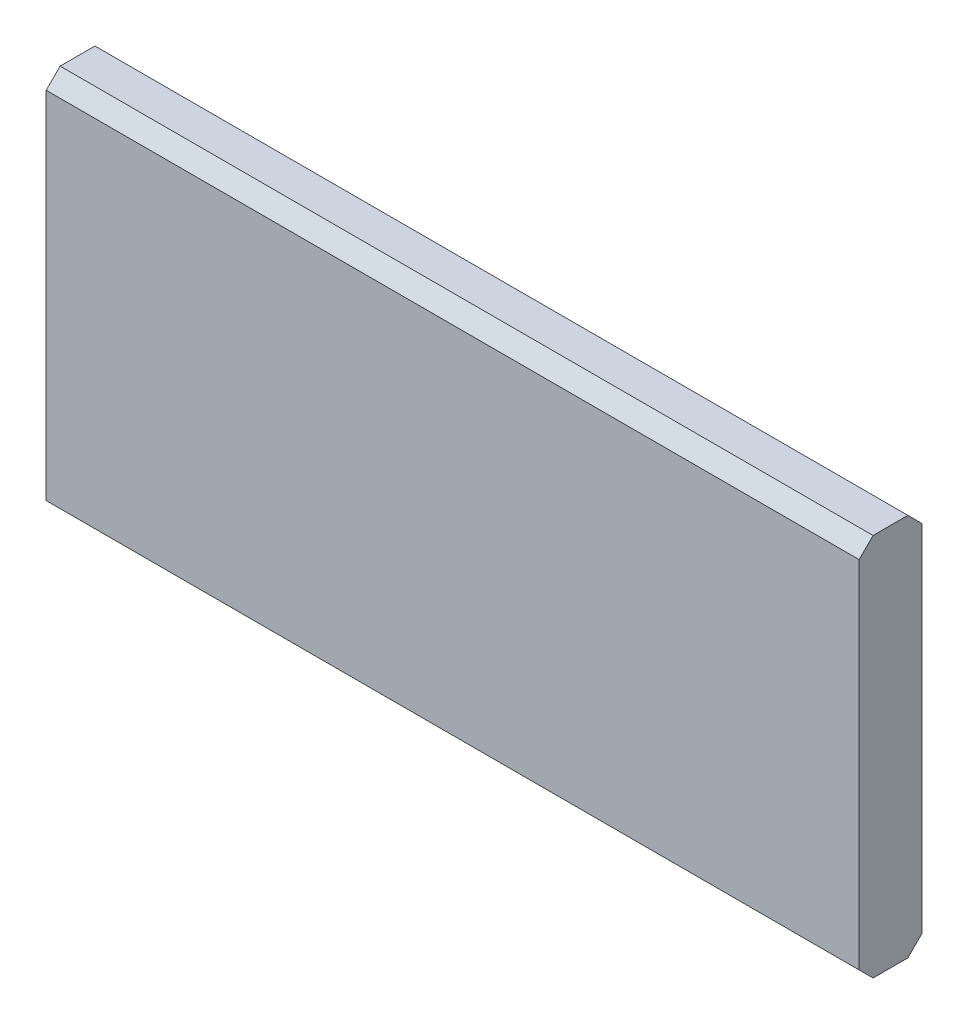
ISO-10303-21;
HEADER;
FILE_DESCRIPTION(('STEP AP214'),'2;1');
FILE_NAME('part.step','',(''),(''),'','','');
FILE_SCHEMA(('AUTOMOTIVE_DESIGN { 1 0 10303 214 1 1 1 1 }'));
ENDSEC;
DATA;
#1=APPLICATION_CONTEXT('core data for automotive mechanical design processes');
#2=APPLICATION_PROTOCOL_DEFINITION('international standard','automotive_design',2000,#1);
#3=PRODUCT_CONTEXT('',#1,'mechanical');
#4=PRODUCT('Part','Part','',(#3));
#5=PRODUCT_RELATED_PRODUCT_CATEGORY('part','',(#4));
#6=PRODUCT_DEFINITION_FORMATION('','',#4);
#7=PRODUCT_DEFINITION_CONTEXT('part definition',#1,'design');
#8=PRODUCT_DEFINITION('design','',#6,#7);
#9=PRODUCT_DEFINITION_SHAPE('','',#8);
#10=(LENGTH_UNIT() NAMED_UNIT(*) SI_UNIT(.MILLI.,.METRE.));
#11=(NAMED_UNIT(*) PLANE_ANGLE_UNIT() SI_UNIT($,.RADIAN.));
#12=(NAMED_UNIT(*) SI_UNIT($,.STERADIAN.) SOLID_ANGLE_UNIT());
#13=UNCERTAINTY_MEASURE_WITH_UNIT(LENGTH_MEASURE(1.E-05),#10,'distance_accuracy_value','');
#14=(GEOMETRIC_REPRESENTATION_CONTEXT(3) GLOBAL_UNCERTAINTY_ASSIGNED_CONTEXT((#13)) GLOBAL_UNIT_ASSIGNED_CONTEXT((#10,
#11,#12)) REPRESENTATION_CONTEXT('',''));
#15=CARTESIAN_POINT('',(0.,0.,0.));
#16=DIRECTION('',(0.,0.,1.));
#17=DIRECTION('',(1.,0.,0.));
#18=AXIS2_PLACEMENT_3D('',#15,#16,#17);
#19=CARTESIAN_POINT('',(0.,0.,27.));
#20=DIRECTION('',(1.,0.,0.));
#21=DIRECTION('',(0.,0.,-1.));
#22=AXIS2_PLACEMENT_3D('',#19,#20,#21);
#23=PLANE('',#22);
#24=DIRECTION('',(0.,-1.,0.));
#25=VECTOR('',#24,1.);
#26=CARTESIAN_POINT('',(0.,0.,0.));
#27=LINE('',#26,#25);
#28=CARTESIAN_POINT('',(0.,159.,0.));
#29=VERTEX_POINT('',#28);
#30=CARTESIAN_POINT('',(0.,6.00000000000001,0.));
#31=VERTEX_POINT('',#30);
#32=EDGE_CURVE('E162',#29,#31,#27,.T.);
#33=ORIENTED_EDGE('',*,*,#32,.T.);
#34=DIRECTION('',(0.,-0.707106781186548,0.707106781186548));
#35=VECTOR('',#34,1.);
#36=CARTESIAN_POINT('',(0.,0.,6.00000000000001));
#37=LINE('',#36,#35);
#38=CARTESIAN_POINT('',(0.,0.,6.00000000000001));
#39=VERTEX_POINT('',#38);
#40=EDGE_CURVE('E143',#31,#39,#37,.T.);
#41=ORIENTED_EDGE('',*,*,#40,.T.);
#42=DIRECTION('',(0.,0.,-1.));
#43=VECTOR('',#42,1.);
#44=CARTESIAN_POINT('',(0.,0.,27.));
#45=LINE('',#44,#43);
#46=CARTESIAN_POINT('',(0.,0.,21.));
#47=VERTEX_POINT('',#46);
#48=EDGE_CURVE('E122',#47,#39,#45,.T.);
#49=ORIENTED_EDGE('',*,*,#48,.F.);
#50=DIRECTION('',(0.,-0.707106781186548,-0.707106781186548));
#51=VECTOR('',#50,1.);
#52=CARTESIAN_POINT('',(0.,6.00000000000001,27.));
#53=LINE('',#52,#51);
#54=CARTESIAN_POINT('',(0.,6.00000000000001,27.));
#55=VERTEX_POINT('',#54);
#56=EDGE_CURVE('E127',#47,#55,#53,.F.);
#57=ORIENTED_EDGE('',*,*,#56,.T.);
#58=DIRECTION('',(0.,-1.,0.));
#59=VECTOR('',#58,1.);
#60=CARTESIAN_POINT('',(0.,0.,27.));
#61=LINE('',#60,#59);
#62=CARTESIAN_POINT('',(0.,159.,27.));
#63=VERTEX_POINT('',#62);
#64=EDGE_CURVE('E153',#63,#55,#61,.T.);
#65=ORIENTED_EDGE('',*,*,#64,.F.);
#66=DIRECTION('',(0.,-0.707106781186544,0.707106781186551));
#67=VECTOR('',#66,1.);
#68=CARTESIAN_POINT('',(0.,159.,27.));
#69=LINE('',#68,#67);
#70=CARTESIAN_POINT('',(0.,165.,21.));
#71=VERTEX_POINT('',#70);
#72=EDGE_CURVE('E58',#63,#71,#69,.F.);
#73=ORIENTED_EDGE('',*,*,#72,.T.);
#74=DIRECTION('',(0.,0.,-1.));
#75=VECTOR('',#74,1.);
#76=CARTESIAN_POINT('',(0.,165.,27.));
#77=LINE('',#76,#75);
#78=CARTESIAN_POINT('',(0.,165.,6.00000000000001));
#79=VERTEX_POINT('',#78);
#80=EDGE_CURVE('E159',#71,#79,#77,.T.);
#81=ORIENTED_EDGE('',*,*,#80,.T.);
#82=DIRECTION('',(0.,-0.707106781186548,-0.707106781186548));
#83=VECTOR('',#82,1.);
#84=CARTESIAN_POINT('',(0.,165.,6.00000000000001));
#85=LINE('',#84,#83);
#86=EDGE_CURVE('E50',#79,#29,#85,.T.);
#87=ORIENTED_EDGE('',*,*,#86,.T.);
#88=EDGE_LOOP('',(#33,#41,#49,#57,#65,#73,#81,#87));
#89=FACE_BOUND('',#88,.T.);
#90=ADVANCED_FACE('F34',(#89),#23,.F.);
#91=CARTESIAN_POINT('',(0.,0.,27.));
#92=DIRECTION('',(0.,1.,0.));
#93=DIRECTION('',(0.,0.,1.));
#94=AXIS2_PLACEMENT_3D('',#91,#92,#93);
#95=PLANE('',#94);
#96=ORIENTED_EDGE('',*,*,#48,.T.);
#97=DIRECTION('',(1.,0.,0.));
#98=VECTOR('',#97,1.);
#99=CARTESIAN_POINT('',(350.,0.,6.00000000000001));
#100=LINE('',#99,#98);
#101=CARTESIAN_POINT('',(350.,0.,6.00000000000001));
#102=VERTEX_POINT('',#101);
#103=EDGE_CURVE('E121',#39,#102,#100,.T.);
#104=ORIENTED_EDGE('',*,*,#103,.T.);
#105=DIRECTION('',(0.,0.,-1.));
#106=VECTOR('',#105,1.);
#107=CARTESIAN_POINT('',(350.,0.,27.));
#108=LINE('',#107,#106);
#109=CARTESIAN_POINT('',(350.,0.,21.));
#110=VERTEX_POINT('',#109);
#111=EDGE_CURVE('E105',#110,#102,#108,.T.);
#112=ORIENTED_EDGE('',*,*,#111,.F.);
#113=DIRECTION('',(-1.,0.,0.));
#114=VECTOR('',#113,1.);
#115=CARTESIAN_POINT('',(0.,0.,21.));
#116=LINE('',#115,#114);
#117=EDGE_CURVE('E118',#110,#47,#116,.T.);
#118=ORIENTED_EDGE('',*,*,#117,.T.);
#119=EDGE_LOOP('',(#96,#104,#112,#118));
#120=FACE_BOUND('',#119,.T.);
#121=ADVANCED_FACE('F117',(#120),#95,.F.);
#122=CARTESIAN_POINT('',(350.,0.,27.));
#123=DIRECTION('',(-1.,0.,0.));
#124=DIRECTION('',(0.,0.,1.));
#125=AXIS2_PLACEMENT_3D('',#122,#123,#124);
#126=PLANE('',#125);
#127=ORIENTED_EDGE('',*,*,#111,.T.);
#128=DIRECTION('',(0.,0.707106781186548,-0.707106781186548));
#129=VECTOR('',#128,1.);
#130=CARTESIAN_POINT('',(350.,0.,6.00000000000001));
#131=LINE('',#130,#129);
#132=CARTESIAN_POINT('',(350.,6.00000000000001,0.));
#133=VERTEX_POINT('',#132);
#134=EDGE_CURVE('E134',#102,#133,#131,.T.);
#135=ORIENTED_EDGE('',*,*,#134,.T.);
#136=DIRECTION('',(0.,1.,0.));
#137=VECTOR('',#136,1.);
#138=CARTESIAN_POINT('',(350.,0.,0.));
#139=LINE('',#138,#137);
#140=CARTESIAN_POINT('',(350.,159.,0.));
#141=VERTEX_POINT('',#140);
#142=EDGE_CURVE('E157',#133,#141,#139,.T.);
#143=ORIENTED_EDGE('',*,*,#142,.T.);
#144=DIRECTION('',(0.,0.707106781186548,0.707106781186548));
#145=VECTOR('',#144,1.);
#146=CARTESIAN_POINT('',(350.,165.,6.00000000000001));
#147=LINE('',#146,#145);
#148=CARTESIAN_POINT('',(350.,165.,6.00000000000001));
#149=VERTEX_POINT('',#148);
#150=EDGE_CURVE('E111',#141,#149,#147,.T.);
#151=ORIENTED_EDGE('',*,*,#150,.T.);
#152=DIRECTION('',(0.,0.,-1.));
#153=VECTOR('',#152,1.);
#154=CARTESIAN_POINT('',(350.,165.,27.));
#155=LINE('',#154,#153);
#156=CARTESIAN_POINT('',(350.,165.,21.));
#157=VERTEX_POINT('',#156);
#158=EDGE_CURVE('E123',#157,#149,#155,.T.);
#159=ORIENTED_EDGE('',*,*,#158,.F.);
#160=DIRECTION('',(0.,0.707106781186544,-0.707106781186551));
#161=VECTOR('',#160,1.);
#162=CARTESIAN_POINT('',(350.,159.,27.));
#163=LINE('',#162,#161);
#164=CARTESIAN_POINT('',(350.,159.,27.));
#165=VERTEX_POINT('',#164);
#166=EDGE_CURVE('E112',#157,#165,#163,.F.);
#167=ORIENTED_EDGE('',*,*,#166,.T.);
#168=DIRECTION('',(0.,1.,0.));
#169=VECTOR('',#168,1.);
#170=CARTESIAN_POINT('',(350.,0.,27.));
#171=LINE('',#170,#169);
#172=CARTESIAN_POINT('',(350.,6.00000000000001,27.));
#173=VERTEX_POINT('',#172);
#174=EDGE_CURVE('E107',#173,#165,#171,.T.);
#175=ORIENTED_EDGE('',*,*,#174,.F.);
#176=DIRECTION('',(0.,0.707106781186548,0.707106781186548));
#177=VECTOR('',#176,1.);
#178=CARTESIAN_POINT('',(350.,6.00000000000001,27.));
#179=LINE('',#178,#177);
#180=EDGE_CURVE('E102',#173,#110,#179,.F.);
#181=ORIENTED_EDGE('',*,*,#180,.T.);
#182=EDGE_LOOP('',(#127,#135,#143,#151,#159,#167,#175,#181));
#183=FACE_BOUND('',#182,.T.);
#184=ADVANCED_FACE('F104',(#183),#126,.F.);
#185=CARTESIAN_POINT('',(0.,165.,27.));
#186=DIRECTION('',(0.,-1.,0.));
#187=DIRECTION('',(0.,0.,-1.));
#188=AXIS2_PLACEMENT_3D('',#185,#186,#187);
#189=PLANE('',#188);
#190=ORIENTED_EDGE('',*,*,#158,.T.);
#191=DIRECTION('',(-1.,0.,0.));
#192=VECTOR('',#191,1.);
#193=CARTESIAN_POINT('',(0.,165.,6.00000000000001));
#194=LINE('',#193,#192);
#195=EDGE_CURVE('E147',#149,#79,#194,.T.);
#196=ORIENTED_EDGE('',*,*,#195,.T.);
#197=ORIENTED_EDGE('',*,*,#80,.F.);
#198=DIRECTION('',(1.,0.,0.));
#199=VECTOR('',#198,1.);
#200=CARTESIAN_POINT('',(0.,165.,21.));
#201=LINE('',#200,#199);
#202=EDGE_CURVE('E145',#71,#157,#201,.T.);
#203=ORIENTED_EDGE('',*,*,#202,.T.);
#204=EDGE_LOOP('',(#190,#196,#197,#203));
#205=FACE_BOUND('',#204,.T.);
#206=ADVANCED_FACE('F170',(#205),#189,.F.);
#207=CARTESIAN_POINT('',(0.,0.,27.));
#208=DIRECTION('',(0.,0.,-1.));
#209=DIRECTION('',(-1.,0.,0.));
#210=AXIS2_PLACEMENT_3D('',#207,#208,#209);
#211=PLANE('',#210);
#212=ORIENTED_EDGE('',*,*,#64,.T.);
#213=DIRECTION('',(1.,0.,0.));
#214=VECTOR('',#213,1.);
#215=CARTESIAN_POINT('',(0.,6.00000000000001,27.));
#216=LINE('',#215,#214);
#217=EDGE_CURVE('E11',#55,#173,#216,.T.);
#218=ORIENTED_EDGE('',*,*,#217,.T.);
#219=ORIENTED_EDGE('',*,*,#174,.T.);
#220=DIRECTION('',(-1.,0.,0.));
#221=VECTOR('',#220,1.);
#222=CARTESIAN_POINT('',(0.,159.,27.));
#223=LINE('',#222,#221);
#224=EDGE_CURVE('E43',#165,#63,#223,.T.);
#225=ORIENTED_EDGE('',*,*,#224,.T.);
#226=EDGE_LOOP('',(#212,#218,#219,#225));
#227=FACE_BOUND('',#226,.T.);
#228=ADVANCED_FACE('F152',(#227),#211,.F.);
#229=CARTESIAN_POINT('',(0.,0.,0.));
#230=DIRECTION('',(0.,0.,-1.));
#231=DIRECTION('',(-1.,0.,0.));
#232=AXIS2_PLACEMENT_3D('',#229,#230,#231);
#233=PLANE('',#232);
#234=ORIENTED_EDGE('',*,*,#142,.F.);
#235=DIRECTION('',(-1.,0.,0.));
#236=VECTOR('',#235,1.);
#237=CARTESIAN_POINT('',(0.,6.00000000000001,0.));
#238=LINE('',#237,#236);
#239=EDGE_CURVE('E138',#133,#31,#238,.T.);
#240=ORIENTED_EDGE('',*,*,#239,.T.);
#241=ORIENTED_EDGE('',*,*,#32,.F.);
#242=DIRECTION('',(1.,0.,0.));
#243=VECTOR('',#242,1.);
#244=CARTESIAN_POINT('',(350.,159.,0.));
#245=LINE('',#244,#243);
#246=EDGE_CURVE('E136',#29,#141,#245,.T.);
#247=ORIENTED_EDGE('',*,*,#246,.T.);
#248=EDGE_LOOP('',(#234,#240,#241,#247));
#249=FACE_BOUND('',#248,.T.);
#250=ADVANCED_FACE('F177',(#249),#233,.T.);
#251=CARTESIAN_POINT('',(0.,0.,6.00000000000001));
#252=DIRECTION('',(0.,-0.707106781186547,-0.707106781186547));
#253=DIRECTION('',(-1.,0.,0.));
#254=AXIS2_PLACEMENT_3D('',#251,#252,#253);
#255=PLANE('',#254);
#256=ORIENTED_EDGE('',*,*,#40,.F.);
#257=ORIENTED_EDGE('',*,*,#239,.F.);
#258=ORIENTED_EDGE('',*,*,#134,.F.);
#259=ORIENTED_EDGE('',*,*,#103,.F.);
#260=EDGE_LOOP('',(#256,#257,#258,#259));
#261=FACE_BOUND('',#260,.T.);
#262=ADVANCED_FACE('F181',(#261),#255,.T.);
#263=CARTESIAN_POINT('',(0.,165.,6.00000000000001));
#264=DIRECTION('',(0.,0.707106781186547,-0.707106781186547));
#265=DIRECTION('',(1.,0.,0.));
#266=AXIS2_PLACEMENT_3D('',#263,#264,#265);
#267=PLANE('',#266);
#268=ORIENTED_EDGE('',*,*,#150,.F.);
#269=ORIENTED_EDGE('',*,*,#246,.F.);
#270=ORIENTED_EDGE('',*,*,#86,.F.);
#271=ORIENTED_EDGE('',*,*,#195,.F.);
#272=EDGE_LOOP('',(#268,#269,#270,#271));
#273=FACE_BOUND('',#272,.T.);
#274=ADVANCED_FACE('F173',(#273),#267,.T.);
#275=CARTESIAN_POINT('',(0.,6.00000000000001,27.));
#276=DIRECTION('',(0.,0.707106781186547,-0.707106781186547));
#277=DIRECTION('',(1.,0.,0.));
#278=AXIS2_PLACEMENT_3D('',#275,#276,#277);
#279=PLANE('',#278);
#280=ORIENTED_EDGE('',*,*,#56,.F.);
#281=ORIENTED_EDGE('',*,*,#117,.F.);
#282=ORIENTED_EDGE('',*,*,#180,.F.);
#283=ORIENTED_EDGE('',*,*,#217,.F.);
#284=EDGE_LOOP('',(#280,#281,#282,#283));
#285=FACE_BOUND('',#284,.T.);
#286=ADVANCED_FACE('F126',(#285),#279,.F.);
#287=CARTESIAN_POINT('',(0.,159.,27.));
#288=DIRECTION('',(0.,-0.707106781186551,-0.707106781186544));
#289=DIRECTION('',(-1.,0.,0.));
#290=AXIS2_PLACEMENT_3D('',#287,#288,#289);
#291=PLANE('',#290);
#292=ORIENTED_EDGE('',*,*,#166,.F.);
#293=ORIENTED_EDGE('',*,*,#202,.F.);
#294=ORIENTED_EDGE('',*,*,#72,.F.);
#295=ORIENTED_EDGE('',*,*,#224,.F.);
#296=EDGE_LOOP('',(#292,#293,#294,#295));
#297=FACE_BOUND('',#296,.T.);
#298=ADVANCED_FACE('F37',(#297),#291,.F.);
#299=CLOSED_SHELL('',(#90,#121,#184,#206,#228,#250,#262,#274,#286,#298));
#300=MANIFOLD_SOLID_BREP('B2',#299);
#301=ADVANCED_BREP_SHAPE_REPRESENTATION('',(#18,#300),#14);
#302=SHAPE_DEFINITION_REPRESENTATION(#9,#301);
ENDSEC;
END-ISO-10303-21;
